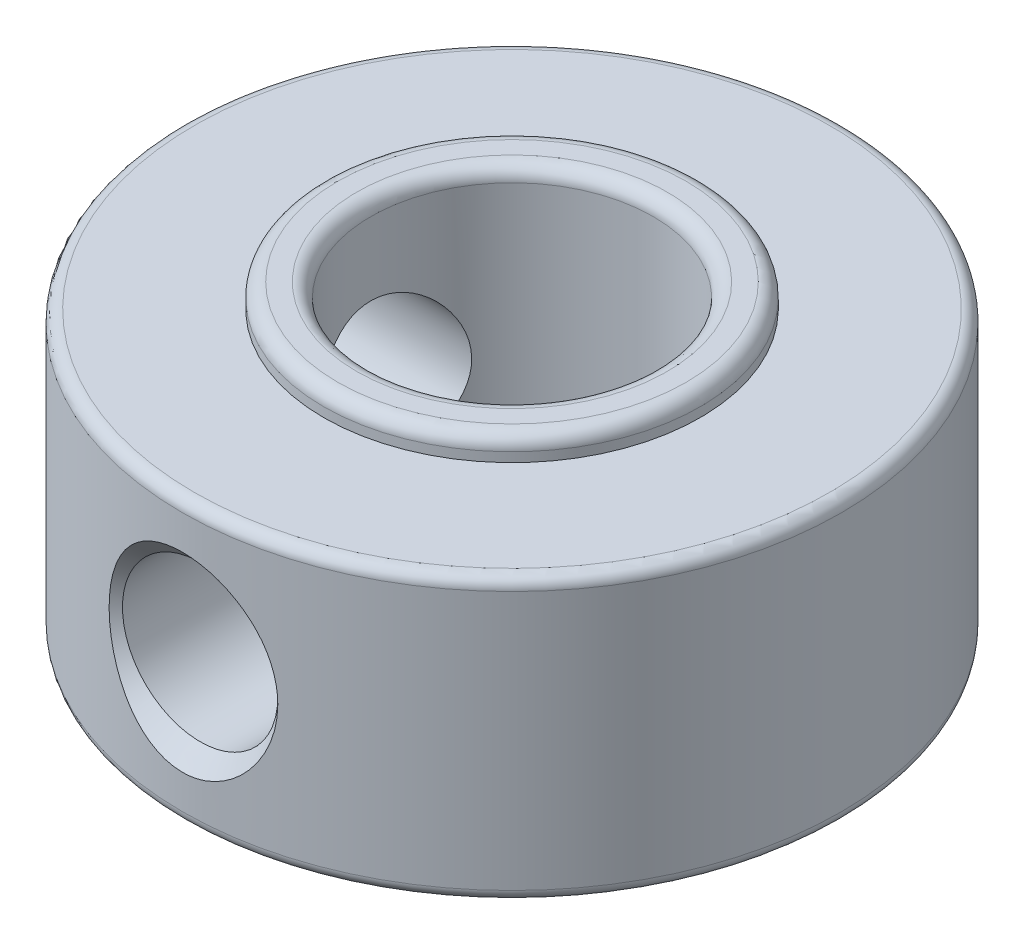
ISO-10303-21;
HEADER;
FILE_DESCRIPTION(('STEP AP214'),'2;1');
FILE_NAME('part.step','',(''),(''),'','','');
FILE_SCHEMA(('AUTOMOTIVE_DESIGN { 1 0 10303 214 1 1 1 1 }'));
ENDSEC;
DATA;
#1=APPLICATION_CONTEXT('core data for automotive mechanical design processes');
#2=APPLICATION_PROTOCOL_DEFINITION('international standard','automotive_design',2000,#1);
#3=PRODUCT_CONTEXT('',#1,'mechanical');
#4=PRODUCT('Part','Part','',(#3));
#5=PRODUCT_RELATED_PRODUCT_CATEGORY('part','',(#4));
#6=PRODUCT_DEFINITION_FORMATION('','',#4);
#7=PRODUCT_DEFINITION_CONTEXT('part definition',#1,'design');
#8=PRODUCT_DEFINITION('design','',#6,#7);
#9=PRODUCT_DEFINITION_SHAPE('','',#8);
#10=(LENGTH_UNIT() NAMED_UNIT(*) SI_UNIT(.MILLI.,.METRE.));
#11=(NAMED_UNIT(*) PLANE_ANGLE_UNIT() SI_UNIT($,.RADIAN.));
#12=(NAMED_UNIT(*) SI_UNIT($,.STERADIAN.) SOLID_ANGLE_UNIT());
#13=UNCERTAINTY_MEASURE_WITH_UNIT(LENGTH_MEASURE(1.E-05),#10,'distance_accuracy_value','');
#14=(GEOMETRIC_REPRESENTATION_CONTEXT(3) GLOBAL_UNCERTAINTY_ASSIGNED_CONTEXT((#13)) GLOBAL_UNIT_ASSIGNED_CONTEXT((#10,
#11,#12)) REPRESENTATION_CONTEXT('',''));
#15=CARTESIAN_POINT('',(0.,0.,0.));
#16=DIRECTION('',(0.,0.,1.));
#17=DIRECTION('',(1.,0.,0.));
#18=AXIS2_PLACEMENT_3D('',#15,#16,#17);
#19=CARTESIAN_POINT('',(0.,6.,0.));
#20=DIRECTION('',(0.,1.,0.));
#21=DIRECTION('',(0.,0.,1.));
#22=AXIS2_PLACEMENT_3D('',#19,#20,#21);
#23=PLANE('',#22);
#24=CARTESIAN_POINT('',(0.,6.,0.));
#25=DIRECTION('',(0.,1.,0.));
#26=DIRECTION('',(0.,0.,1.));
#27=AXIS2_PLACEMENT_3D('',#24,#25,#26);
#28=CIRCLE('',#27,6.75);
#29=CARTESIAN_POINT('',(0.,6.,6.75));
#30=VERTEX_POINT('',#29);
#31=EDGE_CURVE('E50',#30,#30,#28,.T.);
#32=ORIENTED_EDGE('',*,*,#31,.T.);
#33=EDGE_LOOP('',(#32));
#34=FACE_BOUND('',#33,.T.);
#35=CARTESIAN_POINT('',(0.,6.,0.));
#36=DIRECTION('',(0.,1.,0.));
#37=DIRECTION('',(0.,0.,1.));
#38=AXIS2_PLACEMENT_3D('',#35,#36,#37);
#39=CIRCLE('',#38,4.);
#40=CARTESIAN_POINT('',(0.,6.,4.));
#41=VERTEX_POINT('',#40);
#42=EDGE_CURVE('E89',#41,#41,#39,.T.);
#43=ORIENTED_EDGE('',*,*,#42,.F.);
#44=EDGE_LOOP('',(#43));
#45=FACE_BOUND('',#44,.T.);
#46=ADVANCED_FACE('F34',(#34,#45),#23,.T.);
#47=CARTESIAN_POINT('',(0.,0.,0.));
#48=DIRECTION('',(0.,1.,0.));
#49=DIRECTION('',(0.,0.,1.));
#50=AXIS2_PLACEMENT_3D('',#47,#48,#49);
#51=PLANE('',#50);
#52=CARTESIAN_POINT('',(0.,0.,0.));
#53=DIRECTION('',(0.,1.,0.));
#54=DIRECTION('',(0.,0.,1.));
#55=AXIS2_PLACEMENT_3D('',#52,#53,#54);
#56=CIRCLE('',#55,6.75);
#57=CARTESIAN_POINT('',(0.,0.,6.75));
#58=VERTEX_POINT('',#57);
#59=EDGE_CURVE('E54',#58,#58,#56,.F.);
#60=ORIENTED_EDGE('',*,*,#59,.T.);
#61=EDGE_LOOP('',(#60));
#62=FACE_BOUND('',#61,.T.);
#63=CARTESIAN_POINT('',(0.,0.,0.));
#64=DIRECTION('',(0.,1.,0.));
#65=DIRECTION('',(0.,0.,1.));
#66=AXIS2_PLACEMENT_3D('',#63,#64,#65);
#67=CIRCLE('',#66,3.);
#68=CARTESIAN_POINT('',(0.,0.,3.));
#69=VERTEX_POINT('',#68);
#70=EDGE_CURVE('E94',#69,#69,#67,.T.);
#71=ORIENTED_EDGE('',*,*,#70,.T.);
#72=EDGE_LOOP('',(#71));
#73=FACE_BOUND('',#72,.T.);
#74=ADVANCED_FACE('F117',(#62,#73),#51,.F.);
#75=CARTESIAN_POINT('',(0.,6.,0.));
#76=DIRECTION('',(0.,-1.,0.));
#77=DIRECTION('',(0.,0.,-1.));
#78=AXIS2_PLACEMENT_3D('',#75,#76,#77);
#79=CYLINDRICAL_SURFACE('',#78,7.);
#80=CARTESIAN_POINT('',(-6.87359578952103,1.63949092559636,-1.32426621208235));
#81=CARTESIAN_POINT('',(-6.85958303338195,1.72985317819723,-1.39700430517635));
#82=CARTESIAN_POINT('',(-6.84589612643149,1.82673131210786,-1.46185912758933));
#83=CARTESIAN_POINT('',(-6.820808210509,2.03021045980152,-1.57478254868105));
#84=CARTESIAN_POINT('',(-6.80941146577098,2.1368290831704,-1.62281995483144));
#85=CARTESIAN_POINT('',(-6.79017426023101,2.35711382981139,-1.70152481572352));
#86=CARTESIAN_POINT('',(-6.78234906293592,2.47080788405809,-1.73211785571865));
#87=CARTESIAN_POINT('',(-6.77121264697159,2.70173092495826,-1.77515529793583));
#88=CARTESIAN_POINT('',(-6.76789958178469,2.81895844551017,-1.78760712430403));
#89=CARTESIAN_POINT('',(-6.76611964368235,3.0590001213231,-1.79433707930609));
#90=CARTESIAN_POINT('',(-6.76786573540499,3.1818390934097,-1.78781651945037));
#91=CARTESIAN_POINT('',(-6.77645825687172,3.42468982856667,-1.75496312829767));
#92=CARTESIAN_POINT('',(-6.78330610931944,3.54470079337169,-1.72862477048569));
#93=CARTESIAN_POINT('',(-6.80128995036055,3.77875633916343,-1.65645275771337));
#94=CARTESIAN_POINT('',(-6.81243775901388,3.89278348106933,-1.61056532806682));
#95=CARTESIAN_POINT('',(-6.83764161156773,4.1110264336865,-1.49995443148578));
#96=CARTESIAN_POINT('',(-6.8516980295538,4.21524097985733,-1.43522854124074));
#97=CARTESIAN_POINT('',(-6.88045831941093,4.40713047385244,-1.29018663263499));
#98=CARTESIAN_POINT('',(-6.89512946909561,4.49521224860423,-1.21040501078502));
#99=CARTESIAN_POINT('',(-6.92354931193096,4.65479707559183,-1.03550612023776));
#100=CARTESIAN_POINT('',(-6.93729874004048,4.72631345115778,-0.940401280930968));
#101=CARTESIAN_POINT('',(-6.96054348335829,4.84237120528744,-0.747821156421959));
#102=CARTESIAN_POINT('',(-6.97033156888847,4.88893629512083,-0.651606200801385));
#103=CARTESIAN_POINT('',(-6.98612448704767,4.96260309672123,-0.451722639680279));
#104=CARTESIAN_POINT('',(-6.99213432154922,4.98973054786669,-0.348064091999365));
#105=CARTESIAN_POINT('',(-6.99894749138441,5.02034677395272,-0.151767518826994));
#106=CARTESIAN_POINT('',(-7.00035237649864,5.02656970879388,-0.0595704267651771));
#107=CARTESIAN_POINT('',(-6.99949725480007,5.02276007925593,0.124457329254976));
#108=CARTESIAN_POINT('',(-6.99723843902163,5.01273279766869,0.216288102571896));
#109=CARTESIAN_POINT('',(-6.98957490072888,4.97810819206439,0.391230944006008));
#110=CARTESIAN_POINT('',(-6.98436724151803,4.95442198661933,0.474535424107075));
#111=CARTESIAN_POINT('',(-6.97149996791258,4.89437024788566,0.636216769702404));
#112=CARTESIAN_POINT('',(-6.96383997517852,4.8580027580852,0.714592872626157));
#113=CARTESIAN_POINT('',(-6.94630282152861,4.77170906744551,0.869056731950644));
#114=CARTESIAN_POINT('',(-6.93632560977579,4.72113824716319,0.944771276219333));
#115=CARTESIAN_POINT('',(-6.91535459298148,4.60935013168227,1.08770395617125));
#116=CARTESIAN_POINT('',(-6.90436034823307,4.54812822139221,1.15491838688396));
#117=CARTESIAN_POINT('',(-6.88091677928409,4.40877462042631,1.28766145465531));
#118=CARTESIAN_POINT('',(-6.86845401200706,4.32949046948708,1.35197755975986));
#119=CARTESIAN_POINT('',(-6.84458445732909,4.16207180900025,1.46805363591992));
#120=CARTESIAN_POINT('',(-6.83317819661977,4.07393293033306,1.51980736496914));
#121=CARTESIAN_POINT('',(-6.81123069769132,3.88020565834485,1.61549774845669));
#122=CARTESIAN_POINT('',(-6.80094718315777,3.77378254336997,1.65780922978377));
#123=CARTESIAN_POINT('',(-6.78408993326696,3.55540077456816,1.72549781353963));
#124=CARTESIAN_POINT('',(-6.77751726903436,3.44344053259986,1.75087002689004));
#125=CARTESIAN_POINT('',(-6.76852656059429,3.20991891708026,1.78532838014699));
#126=CARTESIAN_POINT('',(-6.76638379936112,3.08818637467319,1.79333684892155));
#127=CARTESIAN_POINT('',(-6.76733137718222,2.84502348440161,1.78975588575182));
#128=CARTESIAN_POINT('',(-6.77042240823588,2.72359317862405,1.77816386227801));
#129=CARTESIAN_POINT('',(-6.78153491091069,2.48290445392508,1.73530349054721));
#130=CARTESIAN_POINT('',(-6.78961752834013,2.36369215522348,1.70379100637556));
#131=CARTESIAN_POINT('',(-6.80977299357164,2.13248812457447,1.62135221348526));
#132=CARTESIAN_POINT('',(-6.82184660845329,2.02049778565465,1.57042217237521));
#133=CARTESIAN_POINT('',(-6.84828599058041,1.80880796178523,1.45074907593046));
#134=CARTESIAN_POINT('',(-6.86261756501572,1.70895927459034,1.3822634554608));
#135=CARTESIAN_POINT('',(-6.89185407270496,1.52346155481056,1.22819818676186));
#136=CARTESIAN_POINT('',(-6.90675882378795,1.43780805582243,1.14262393409211));
#137=CARTESIAN_POINT('',(-6.93398596018628,1.29047399721376,0.963043299679111));
#138=CARTESIAN_POINT('',(-6.94641783889914,1.22748797538864,0.870130440468874));
#139=CARTESIAN_POINT('',(-6.96821846834868,1.12073923215364,0.673532937375931));
#140=CARTESIAN_POINT('',(-6.97759148709104,1.0769496964614,0.569863570647384));
#141=CARTESIAN_POINT('',(-6.99082340905235,1.01609607633617,0.370135060658223));
#142=CARTESIAN_POINT('',(-6.99526151264695,0.996194046897193,0.274976891819246));
#143=CARTESIAN_POINT('',(-7.00017276638536,0.974200619229602,0.0825414787060494));
#144=CARTESIAN_POINT('',(-7.00064877632136,0.97209637475324,-0.0147341863279816));
#145=CARTESIAN_POINT('',(-6.99773389362166,0.98511709275393,-0.198266816928));
#146=CARTESIAN_POINT('',(-6.99472335819632,0.998547186723714,-0.284656397013251));
#147=CARTESIAN_POINT('',(-6.98577870226897,1.0392079040996,-0.453965386225114));
#148=CARTESIAN_POINT('',(-6.97984397155625,1.06644140798641,-0.536884067136763));
#149=CARTESIAN_POINT('',(-6.96554171606365,1.13396797876902,-0.698518729565626));
#150=CARTESIAN_POINT('',(-6.95713682325865,1.17446282372167,-0.77714635497339));
#151=CARTESIAN_POINT('',(-6.93873400044345,1.26672803443802,-0.927193415021082));
#152=CARTESIAN_POINT('',(-6.92873679327125,1.31849328784491,-0.998616096461568));
#153=CARTESIAN_POINT('',(-6.91108573610624,1.41475419430979,-1.11318824076734));
#154=CARTESIAN_POINT('',(-6.9036191041308,1.45683393296166,-1.15842940165299));
#155=CARTESIAN_POINT('',(-6.88860281585189,1.54515759995637,-1.24461335989313));
#156=CARTESIAN_POINT('',(-6.88105315915174,1.5914015482019,-1.28555613670165));
#157=CARTESIAN_POINT('',(-6.87359578952103,1.63949092559636,-1.32426621208235));
#158=B_SPLINE_CURVE_WITH_KNOTS('',3,(#80,#81,#82,#83,#84,#85,#86,#87,#88,#89,#90,#91,#92,#93,
#94,#95,#96,#97,#98,#99,#100,#101,#102,#103,#104,#105,#106,#107,#108,#109,#110,#111,#112,#113,
#114,#115,#116,#117,#118,#119,#120,#121,#122,#123,#124,#125,#126,#127,#128,#129,#130,#131,#132,
#133,#134,#135,#136,#137,#138,#139,#140,#141,#142,#143,#144,#145,#146,#147,#148,#149,#150,#151,
#152,#153,#154,#155,#156,#157),.UNSPECIFIED.,.T.,.F.,(4,2,2,2,2,2,2,2,2,2,2,2,2,2,2,2,2,2,2,2,2,
2,2,2,2,2,2,2,2,2,2,2,2,2,2,2,2,2,4),(0.,0.350301087654824,0.701248505056425,1.05368201579301,
1.40597125538907,1.77330266509892,2.14073654912412,2.50918774656418,2.87768636118012,
3.23497054941263,3.59196637312953,3.91207465179538,4.23175825479954,4.50755014610567,
4.78325239805685,5.04239822079371,5.30158404313585,5.57526733671498,5.84906951329984,
6.15637300433501,6.46382887750418,6.80728976595826,7.15084974264326,7.51518613494137,
7.87957070267978,8.24850994798461,8.61752014559749,8.98140122094162,9.34516758572792,
9.68199902808364,10.0183584622883,10.3086721815315,10.5987763375894,10.8599910565155,
11.121260307904,11.3867055121439,11.6520305580308,11.8384544264437,12.0248791859097),.UNSPECIFIED.);
#159=CARTESIAN_POINT('',(-6.87359578952103,1.63949092559636,-1.32426621208235));
#160=VERTEX_POINT('',#159);
#161=EDGE_CURVE('E10',#160,#160,#158,.T.);
#162=ORIENTED_EDGE('',*,*,#161,.T.);
#163=EDGE_LOOP('',(#162));
#164=FACE_BOUND('',#163,.T.);
#165=CARTESIAN_POINT('',(-1.32426621208233,1.63949092559636,6.87359578952103));
#166=CARTESIAN_POINT('',(-1.39700430517632,1.72985317819723,6.85958303338196));
#167=CARTESIAN_POINT('',(-1.4618591275893,1.82673131210786,6.8458961264315));
#168=CARTESIAN_POINT('',(-1.57478254868103,2.03021045980152,6.820808210509));
#169=CARTESIAN_POINT('',(-1.62281995483142,2.1368290831704,6.80941146577098));
#170=CARTESIAN_POINT('',(-1.70152481572349,2.35711382981139,6.79017426023102));
#171=CARTESIAN_POINT('',(-1.73211785571863,2.47080788405809,6.78234906293593));
#172=CARTESIAN_POINT('',(-1.77515529793581,2.70173092495826,6.7712126469716));
#173=CARTESIAN_POINT('',(-1.78760712430401,2.81895844551017,6.7678995817847));
#174=CARTESIAN_POINT('',(-1.79433707930607,3.0590001213231,6.76611964368236));
#175=CARTESIAN_POINT('',(-1.78781651945035,3.1818390934097,6.767865735405));
#176=CARTESIAN_POINT('',(-1.75496312829765,3.42468982856667,6.77645825687173));
#177=CARTESIAN_POINT('',(-1.72862477048567,3.54470079337169,6.78330610931945));
#178=CARTESIAN_POINT('',(-1.65645275771335,3.77875633916343,6.80128995036056));
#179=CARTESIAN_POINT('',(-1.6105653280668,3.89278348106933,6.81243775901389));
#180=CARTESIAN_POINT('',(-1.49995443148576,4.11102643368651,6.83764161156773));
#181=CARTESIAN_POINT('',(-1.43522854124072,4.21524097985733,6.85169802955381));
#182=CARTESIAN_POINT('',(-1.29018663263497,4.40713047385244,6.88045831941093));
#183=CARTESIAN_POINT('',(-1.210405010785,4.49521224860423,6.89512946909561));
#184=CARTESIAN_POINT('',(-1.03550612023773,4.65479707559183,6.92354931193096));
#185=CARTESIAN_POINT('',(-0.940401280930944,4.72631345115778,6.93729874004048));
#186=CARTESIAN_POINT('',(-0.747821156421934,4.84237120528744,6.9605434833583));
#187=CARTESIAN_POINT('',(-0.65160620080136,4.88893629512083,6.97033156888847));
#188=CARTESIAN_POINT('',(-0.451722639680254,4.96260309672123,6.98612448704767));
#189=CARTESIAN_POINT('',(-0.34806409199934,4.98973054786669,6.99213432154922));
#190=CARTESIAN_POINT('',(-0.151767518826969,5.02034677395272,6.99894749138441));
#191=CARTESIAN_POINT('',(-0.0595704267651527,5.02656970879388,7.00035237649864));
#192=CARTESIAN_POINT('',(0.124457329255,5.02276007925593,6.99949725480007));
#193=CARTESIAN_POINT('',(0.216288102571921,5.01273279766869,6.99723843902163));
#194=CARTESIAN_POINT('',(0.391230944006032,4.97810819206439,6.98957490072888));
#195=CARTESIAN_POINT('',(0.4745354241071,4.95442198661933,6.98436724151803));
#196=CARTESIAN_POINT('',(0.636216769702429,4.89437024788566,6.97149996791257));
#197=CARTESIAN_POINT('',(0.714592872626182,4.8580027580852,6.96383997517852));
#198=CARTESIAN_POINT('',(0.869056731950668,4.77170906744551,6.94630282152861));
#199=CARTESIAN_POINT('',(0.944771276219356,4.72113824716319,6.93632560977579));
#200=CARTESIAN_POINT('',(1.08770395617127,4.60935013168227,6.91535459298147));
#201=CARTESIAN_POINT('',(1.15491838688398,4.54812822139221,6.90436034823307));
#202=CARTESIAN_POINT('',(1.28766145465533,4.40877462042631,6.88091677928409));
#203=CARTESIAN_POINT('',(1.35197755975988,4.32949046948708,6.86845401200705));
#204=CARTESIAN_POINT('',(1.46805363591994,4.16207180900025,6.84458445732908));
#205=CARTESIAN_POINT('',(1.51980736496917,4.07393293033306,6.83317819661976));
#206=CARTESIAN_POINT('',(1.61549774845672,3.88020565834485,6.81123069769132));
#207=CARTESIAN_POINT('',(1.65780922978379,3.77378254336997,6.80094718315777));
#208=CARTESIAN_POINT('',(1.72549781353965,3.55540077456816,6.78408993326695));
#209=CARTESIAN_POINT('',(1.75087002689007,3.44344053259986,6.77751726903435));
#210=CARTESIAN_POINT('',(1.78532838014701,3.20991891708026,6.76852656059429));
#211=CARTESIAN_POINT('',(1.79333684892158,3.08818637467319,6.76638379936111));
#212=CARTESIAN_POINT('',(1.78975588575184,2.84502348440161,6.76733137718221));
#213=CARTESIAN_POINT('',(1.77816386227803,2.72359317862405,6.77042240823587));
#214=CARTESIAN_POINT('',(1.73530349054723,2.48290445392508,6.78153491091068));
#215=CARTESIAN_POINT('',(1.70379100637558,2.36369215522347,6.78961752834012));
#216=CARTESIAN_POINT('',(1.62135221348528,2.13248812457446,6.80977299357163));
#217=CARTESIAN_POINT('',(1.57042217237524,2.02049778565465,6.82184660845329));
#218=CARTESIAN_POINT('',(1.45074907593048,1.80880796178523,6.84828599058041));
#219=CARTESIAN_POINT('',(1.38226345546082,1.70895927459034,6.86261756501571));
#220=CARTESIAN_POINT('',(1.22819818676188,1.52346155481056,6.89185407270496));
#221=CARTESIAN_POINT('',(1.14262393409214,1.43780805582243,6.90675882378795));
#222=CARTESIAN_POINT('',(0.963043299679133,1.29047399721376,6.93398596018628));
#223=CARTESIAN_POINT('',(0.870130440468897,1.22748797538864,6.94641783889914));
#224=CARTESIAN_POINT('',(0.673532937375954,1.12073923215364,6.96821846834868));
#225=CARTESIAN_POINT('',(0.569863570647407,1.0769496964614,6.97759148709104));
#226=CARTESIAN_POINT('',(0.370135060658246,1.01609607633617,6.99082340905235));
#227=CARTESIAN_POINT('',(0.27497689181927,0.996194046897193,6.99526151264695));
#228=CARTESIAN_POINT('',(0.0825414787060733,0.974200619229602,7.00017276638536));
#229=CARTESIAN_POINT('',(-0.0147341863279577,0.972096374753239,7.00064877632136));
#230=CARTESIAN_POINT('',(-0.198266816927976,0.985117092753929,6.99773389362167));
#231=CARTESIAN_POINT('',(-0.284656397013227,0.998547186723713,6.99472335819632));
#232=CARTESIAN_POINT('',(-0.45396538622509,1.0392079040996,6.98577870226897));
#233=CARTESIAN_POINT('',(-0.53688406713674,1.06644140798641,6.97984397155625));
#234=CARTESIAN_POINT('',(-0.698518729565602,1.13396797876902,6.96554171606365));
#235=CARTESIAN_POINT('',(-0.777146354973366,1.17446282372167,6.95713682325865));
#236=CARTESIAN_POINT('',(-0.927193415021058,1.26672803443802,6.93873400044345));
#237=CARTESIAN_POINT('',(-0.998616096461544,1.31849328784491,6.92873679327126));
#238=CARTESIAN_POINT('',(-1.11318824076732,1.41475419430979,6.91108573610625));
#239=CARTESIAN_POINT('',(-1.15842940165296,1.45683393296166,6.90361910413081));
#240=CARTESIAN_POINT('',(-1.24461335989311,1.54515759995637,6.88860281585189));
#241=CARTESIAN_POINT('',(-1.28555613670162,1.5914015482019,6.88105315915175));
#242=CARTESIAN_POINT('',(-1.32426621208233,1.63949092559636,6.87359578952103));
#243=B_SPLINE_CURVE_WITH_KNOTS('',3,(#165,#166,#167,#168,#169,#170,#171,#172,#173,#174,#175,
#176,#177,#178,#179,#180,#181,#182,#183,#184,#185,#186,#187,#188,#189,#190,#191,#192,#193,#194,
#195,#196,#197,#198,#199,#200,#201,#202,#203,#204,#205,#206,#207,#208,#209,#210,#211,#212,#213,
#214,#215,#216,#217,#218,#219,#220,#221,#222,#223,#224,#225,#226,#227,#228,#229,#230,#231,#232,
#233,#234,#235,#236,#237,#238,#239,#240,#241,#242),.UNSPECIFIED.,.T.,.F.,(4,2,2,2,2,2,2,2,2,2,2,
2,2,2,2,2,2,2,2,2,2,2,2,2,2,2,2,2,2,2,2,2,2,2,2,2,2,2,4),(0.,0.350301087654825,
0.701248505056426,1.05368201579301,1.40597125538907,1.77330266509892,2.14073654912413,
2.50918774656418,2.87768636118012,3.23497054941263,3.59196637312953,3.91207465179538,
4.23175825479954,4.50755014610567,4.78325239805685,5.04239822079371,5.30158404313585,
5.57526733671498,5.84906951329984,6.15637300433501,6.46382887750418,6.80728976595826,
7.15084974264326,7.51518613494138,7.87957070267978,8.24850994798461,8.61752014559749,
8.98140122094161,9.34516758572792,9.68199902808364,10.0183584622883,10.3086721815315,
10.5987763375894,10.8599910565155,11.121260307904,11.3867055121439,11.6520305580308,
11.8384544264437,12.0248791859097),.UNSPECIFIED.);
#244=CARTESIAN_POINT('',(-1.32426621208233,1.63949092559636,6.87359578952103));
#245=VERTEX_POINT('',#244);
#246=EDGE_CURVE('E46',#245,#245,#243,.T.);
#247=ORIENTED_EDGE('',*,*,#246,.T.);
#248=EDGE_LOOP('',(#247));
#249=FACE_BOUND('',#248,.T.);
#250=CARTESIAN_POINT('',(0.,0.25,0.));
#251=DIRECTION('',(0.,1.,0.));
#252=DIRECTION('',(0.,0.,1.));
#253=AXIS2_PLACEMENT_3D('',#250,#251,#252);
#254=CIRCLE('',#253,7.);
#255=CARTESIAN_POINT('',(0.,0.25,7.));
#256=VERTEX_POINT('',#255);
#257=EDGE_CURVE('E112',#256,#256,#254,.T.);
#258=ORIENTED_EDGE('',*,*,#257,.T.);
#259=EDGE_LOOP('',(#258));
#260=FACE_BOUND('',#259,.T.);
#261=CARTESIAN_POINT('',(0.,5.75,0.));
#262=DIRECTION('',(0.,1.,0.));
#263=DIRECTION('',(0.,0.,1.));
#264=AXIS2_PLACEMENT_3D('',#261,#262,#263);
#265=CIRCLE('',#264,7.);
#266=CARTESIAN_POINT('',(0.,5.75,7.));
#267=VERTEX_POINT('',#266);
#268=EDGE_CURVE('E109',#267,#267,#265,.F.);
#269=ORIENTED_EDGE('',*,*,#268,.T.);
#270=EDGE_LOOP('',(#269));
#271=FACE_BOUND('',#270,.T.);
#272=ADVANCED_FACE('F61',(#164,#249,#260,#271),#79,.T.);
#273=CARTESIAN_POINT('',(0.,6.,0.));
#274=DIRECTION('',(0.,-1.,0.));
#275=DIRECTION('',(0.,0.,-1.));
#276=AXIS2_PLACEMENT_3D('',#273,#274,#275);
#277=CYLINDRICAL_SURFACE('',#276,3.);
#278=CARTESIAN_POINT('',(-2.50549396327352,3.,1.64999999999998));
#279=CARTESIAN_POINT('',(-2.50550290729146,2.91543775587578,1.64999358115513));
#280=CARTESIAN_POINT('',(-2.50984278304634,2.83080158035625,1.64345412095507));
#281=CARTESIAN_POINT('',(-2.52652305472094,2.6642419893439,1.61768357796127));
#282=CARTESIAN_POINT('',(-2.53887693813341,2.58232339226291,1.59843109830518));
#283=CARTESIAN_POINT('',(-2.56969514424061,2.42394184165836,1.5483913350412));
#284=CARTESIAN_POINT('',(-2.58812128253768,2.34744833636022,1.51767597794514));
#285=CARTESIAN_POINT('',(-2.62894573960705,2.20072925067674,1.44580368027314));
#286=CARTESIAN_POINT('',(-2.6513448858674,2.13050498062123,1.404644563727));
#287=CARTESIAN_POINT('',(-2.70034227169486,1.99050697951391,1.30818987552101));
#288=CARTESIAN_POINT('',(-2.72713610292844,1.92149614307966,1.25188597568527));
#289=CARTESIAN_POINT('',(-2.7803340212233,1.79328457524385,1.12882249865067));
#290=CARTESIAN_POINT('',(-2.80673786625031,1.73408972055438,1.06205670422281));
#291=CARTESIAN_POINT('',(-2.85888255333957,1.62218721247504,0.912984038802328));
#292=CARTESIAN_POINT('',(-2.88437182872329,1.57047291087438,0.829835009326239));
#293=CARTESIAN_POINT('',(-2.9291637746478,1.48212209381967,0.65434955639788));
#294=CARTESIAN_POINT('',(-2.94847115688417,1.44547408910425,0.562020200659671));
#295=CARTESIAN_POINT('',(-2.97729382330391,1.39150601520038,0.378922854343159));
#296=CARTESIAN_POINT('',(-2.98749000620555,1.37283185672805,0.288663762188296));
#297=CARTESIAN_POINT('',(-2.99953120217528,1.35082522164807,0.105768848971913));
#298=CARTESIAN_POINT('',(-3.00138254652496,1.34748111400143,0.0131348834272767));
#299=CARTESIAN_POINT('',(-2.99679126383707,1.35584012373691,-0.161456942743388));
#300=CARTESIAN_POINT('',(-2.99119680588262,1.36600430103804,-0.243517036042426));
#301=CARTESIAN_POINT('',(-2.97370139090637,1.39825613933328,-0.404548934713688));
#302=CARTESIAN_POINT('',(-2.96179994958743,1.42034471597396,-0.483520502425816));
#303=CARTESIAN_POINT('',(-2.93258792133284,1.47581759545011,-0.637279429786414));
#304=CARTESIAN_POINT('',(-2.91522047737549,1.50932095125489,-0.712012587065499));
#305=CARTESIAN_POINT('',(-2.87655421939416,1.58643144614226,-0.854941741305344));
#306=CARTESIAN_POINT('',(-2.85525414826244,1.63004181718505,-0.923135637298126));
#307=CARTESIAN_POINT('',(-2.80791814382438,1.73148475004153,-1.05891717191854));
#308=CARTESIAN_POINT('',(-2.78161920172534,1.79034393087261,-1.12564617195586));
#309=CARTESIAN_POINT('',(-2.72855637999779,1.91792420544976,-1.24879377983836));
#310=CARTESIAN_POINT('',(-2.70179204741386,1.98665544125848,-1.3052016470546));
#311=CARTESIAN_POINT('',(-2.64816260741378,2.13929795422944,-1.41104757147093));
#312=CARTESIAN_POINT('',(-2.62149493557528,2.22401217497651,-1.45943898084593));
#313=CARTESIAN_POINT('',(-2.57442669454811,2.4020876587557,-1.54096072440202));
#314=CARTESIAN_POINT('',(-2.55401888906632,2.49543877389512,-1.57410870202277));
#315=CARTESIAN_POINT('',(-2.52428868885372,2.68038243391405,-1.621324807476));
#316=CARTESIAN_POINT('',(-2.51420388175754,2.77150770718116,-1.63671808149072));
#317=CARTESIAN_POINT('',(-2.50421132283931,2.95556143260455,-1.65197600548299));
#318=CARTESIAN_POINT('',(-2.50429193328554,3.0484877010052,-1.65185841284551));
#319=CARTESIAN_POINT('',(-2.51381291635781,3.21898069677553,-1.63731066997579));
#320=CARTESIAN_POINT('',(-2.52189118280772,3.29681676278818,-1.6249632757909));
#321=CARTESIAN_POINT('',(-2.54430898316227,3.4490948427084,-1.58963092545288));
#322=CARTESIAN_POINT('',(-2.55865126498177,3.52353535119722,-1.56664130047228));
#323=CARTESIAN_POINT('',(-2.59264701052962,3.67056841434069,-1.50974087534156));
#324=CARTESIAN_POINT('',(-2.61249886195853,3.74295082069504,-1.47541058671725));
#325=CARTESIAN_POINT('',(-2.6551752562818,3.88136153298298,-1.39715088074391));
#326=CARTESIAN_POINT('',(-2.67800126759515,3.94738667198258,-1.35321671440464));
#327=CARTESIAN_POINT('',(-2.72838745980259,4.08217598283305,-1.24890384728535));
#328=CARTESIAN_POINT('',(-2.75612471210542,4.14971665545364,-1.18702256034847));
#329=CARTESIAN_POINT('',(-2.81021466477288,4.27394463458244,-1.05259034248068));
#330=CARTESIAN_POINT('',(-2.83656654669951,4.33062557660594,-0.980033198593376));
#331=CARTESIAN_POINT('',(-2.88655886174343,4.43418356477833,-0.821591432017623));
#332=CARTESIAN_POINT('',(-2.90999476284885,4.48041980778174,-0.735218364495388));
#333=CARTESIAN_POINT('',(-2.94980224898628,4.55721430537586,-0.554269536180267));
#334=CARTESIAN_POINT('',(-2.96618117604292,4.58778886056153,-0.459702424085396));
#335=CARTESIAN_POINT('',(-2.98862325067975,4.62930611839182,-0.275417797995461));
#336=CARTESIAN_POINT('',(-2.99556705432428,4.64193096934434,-0.186187129425343));
#337=CARTESIAN_POINT('',(-3.00133436858647,4.65243189343454,-0.00661676308887106));
#338=CARTESIAN_POINT('',(-3.00016215675142,4.65031573581961,0.0837223254250865));
#339=CARTESIAN_POINT('',(-2.99031042427524,4.63233007153812,0.254358366297024));
#340=CARTESIAN_POINT('',(-2.98231104671829,4.61770633320566,0.334831363047826));
#341=CARTESIAN_POINT('',(-2.9604470102538,4.57703517800952,0.49198583387687));
#342=CARTESIAN_POINT('',(-2.94658165149358,4.55098639804465,0.568666854326139));
#343=CARTESIAN_POINT('',(-2.91359875185443,4.48738736796037,0.719080279481083));
#344=CARTESIAN_POINT('',(-2.89431787940932,4.44947440595497,0.792622296205392));
#345=CARTESIAN_POINT('',(-2.85231650614788,4.36367449851232,0.932542405269443));
#346=CARTESIAN_POINT('',(-2.82959461529655,4.31578351940047,0.998917583844708));
#347=CARTESIAN_POINT('',(-2.77974517125016,4.20507399834961,1.13072210629173));
#348=CARTESIAN_POINT('',(-2.75241145940814,4.14117216627432,1.19516495605845));
#349=CARTESIAN_POINT('',(-2.69823878537055,4.00349286244808,1.31290440702819));
#350=CARTESIAN_POINT('',(-2.67140046184163,3.92970353472664,1.3661874269137));
#351=CARTESIAN_POINT('',(-2.61945108088932,3.76827599994855,1.46345962344262));
#352=CARTESIAN_POINT('',(-2.59457299089605,3.68004360140734,1.50659692748027));
#353=CARTESIAN_POINT('',(-2.55252885584285,3.49582119959131,1.57680093269353));
#354=CARTESIAN_POINT('',(-2.53533827536758,3.39985704717182,1.60391885150152));
#355=CARTESIAN_POINT('',(-2.51766925413211,3.25219121694153,1.63139486596089));
#356=CARTESIAN_POINT('',(-2.51313062613143,3.20212523584002,1.63835444049928));
#357=CARTESIAN_POINT('',(-2.50704033236466,3.10138168759252,1.64765888075613));
#358=CARTESIAN_POINT('',(-2.50548860037559,3.05070413403086,1.65000384878584));
#359=CARTESIAN_POINT('',(-2.50549396327352,3.,1.64999999999998));
#360=B_SPLINE_CURVE_WITH_KNOTS('',3,(#278,#279,#280,#281,#282,#283,#284,#285,#286,#287,#288,
#289,#290,#291,#292,#293,#294,#295,#296,#297,#298,#299,#300,#301,#302,#303,#304,#305,#306,#307,
#308,#309,#310,#311,#312,#313,#314,#315,#316,#317,#318,#319,#320,#321,#322,#323,#324,#325,#326,
#327,#328,#329,#330,#331,#332,#333,#334,#335,#336,#337,#338,#339,#340,#341,#342,#343,#344,#345,
#346,#347,#348,#349,#350,#351,#352,#353,#354,#355,#356,#357,#358,#359),.UNSPECIFIED.,.T.,.F.,(4,
2,2,2,2,2,2,2,2,2,2,2,2,2,2,2,2,2,2,2,2,2,2,2,2,2,2,2,2,2,2,2,2,2,2,2,2,2,2,2,4),(0.,
0.253471464978915,0.507370630471961,0.759702723718413,1.0120874338999,1.28998079678324,
1.56803993512379,1.86997289364919,2.17167517502775,2.44828286528194,2.72468065617496,
2.97213663093978,3.21961160997026,3.46975098230536,3.71997045333203,3.99717687977862,
4.27467015892954,4.57652503396564,4.87802964361058,5.1551747562746,5.43200258623576,
5.66859462056205,5.90529054812097,6.15196333618105,6.3987583777052,6.68465599353128,
6.97072065421032,7.27125286686229,7.5714716485053,7.8411174720333,8.11062118950827,
8.35604451303951,8.60149712555495,8.85533990697402,9.10928550569671,9.39243346006444,
9.67592402360683,9.9782355672993,10.279575245972,10.4315619419379,10.5835452681421),.UNSPECIFIED.);
#361=CARTESIAN_POINT('',(-2.50549396327352,3.,1.64999999999998));
#362=VERTEX_POINT('',#361);
#363=EDGE_CURVE('E257',#362,#362,#360,.T.);
#364=ORIENTED_EDGE('',*,*,#363,.F.);
#365=EDGE_LOOP('',(#364));
#366=FACE_BOUND('',#365,.T.);
#367=CARTESIAN_POINT('',(1.64999999999999,3.,2.50549396327352));
#368=CARTESIAN_POINT('',(1.64999358115514,2.91543775587578,2.50550290729146));
#369=CARTESIAN_POINT('',(1.64345412095508,2.83080158035625,2.50984278304634));
#370=CARTESIAN_POINT('',(1.61768357796128,2.6642419893439,2.52652305472094));
#371=CARTESIAN_POINT('',(1.59843109830519,2.58232339226291,2.5388769381334));
#372=CARTESIAN_POINT('',(1.54839133504121,2.42394184165836,2.56969514424061));
#373=CARTESIAN_POINT('',(1.51767597794515,2.34744833636022,2.58812128253768));
#374=CARTESIAN_POINT('',(1.44580368027315,2.20072925067674,2.62894573960704));
#375=CARTESIAN_POINT('',(1.40464456372701,2.13050498062123,2.6513448858674));
#376=CARTESIAN_POINT('',(1.30818987552102,1.99050697951391,2.70034227169486));
#377=CARTESIAN_POINT('',(1.25188597568528,1.92149614307966,2.72713610292843));
#378=CARTESIAN_POINT('',(1.12882249865068,1.79328457524385,2.7803340212233));
#379=CARTESIAN_POINT('',(1.06205670422282,1.73408972055438,2.8067378662503));
#380=CARTESIAN_POINT('',(0.912984038802338,1.62218721247504,2.85888255333956));
#381=CARTESIAN_POINT('',(0.829835009326248,1.57047291087438,2.88437182872328));
#382=CARTESIAN_POINT('',(0.654349556397889,1.48212209381967,2.92916377464779));
#383=CARTESIAN_POINT('',(0.562020200659681,1.44547408910425,2.94847115688416));
#384=CARTESIAN_POINT('',(0.378922854343169,1.39150601520038,2.9772938233039));
#385=CARTESIAN_POINT('',(0.288663762188306,1.37283185672805,2.98749000620555));
#386=CARTESIAN_POINT('',(0.105768848971924,1.35082522164807,2.99953120217528));
#387=CARTESIAN_POINT('',(0.013134883427287,1.34748111400143,3.00138254652496));
#388=CARTESIAN_POINT('',(-0.161456942743378,1.35584012373691,2.99679126383707));
#389=CARTESIAN_POINT('',(-0.243517036042415,1.36600430103804,2.99119680588262));
#390=CARTESIAN_POINT('',(-0.404548934713678,1.39825613933328,2.97370139090637));
#391=CARTESIAN_POINT('',(-0.483520502425805,1.42034471597396,2.96179994958743));
#392=CARTESIAN_POINT('',(-0.637279429786404,1.47581759545011,2.93258792133285));
#393=CARTESIAN_POINT('',(-0.712012587065489,1.50932095125489,2.91522047737549));
#394=CARTESIAN_POINT('',(-0.854941741305334,1.58643144614226,2.87655421939416));
#395=CARTESIAN_POINT('',(-0.923135637298116,1.63004181718505,2.85525414826244));
#396=CARTESIAN_POINT('',(-1.05891717191853,1.73148475004153,2.80791814382438));
#397=CARTESIAN_POINT('',(-1.12564617195585,1.79034393087261,2.78161920172535));
#398=CARTESIAN_POINT('',(-1.24879377983835,1.91792420544976,2.7285563799978));
#399=CARTESIAN_POINT('',(-1.30520164705459,1.98665544125848,2.70179204741387));
#400=CARTESIAN_POINT('',(-1.41104757147092,2.13929795422944,2.64816260741379));
#401=CARTESIAN_POINT('',(-1.45943898084593,2.22401217497652,2.62149493557529));
#402=CARTESIAN_POINT('',(-1.54096072440201,2.4020876587557,2.57442669454812));
#403=CARTESIAN_POINT('',(-1.57410870202276,2.49543877389512,2.55401888906633));
#404=CARTESIAN_POINT('',(-1.62132480747599,2.68038243391405,2.52428868885372));
#405=CARTESIAN_POINT('',(-1.63671808149071,2.77150770718116,2.51420388175755));
#406=CARTESIAN_POINT('',(-1.65197600548299,2.95556143260455,2.50421132283932));
#407=CARTESIAN_POINT('',(-1.6518584128455,3.0484877010052,2.50429193328555));
#408=CARTESIAN_POINT('',(-1.63731066997578,3.21898069677553,2.51381291635782));
#409=CARTESIAN_POINT('',(-1.62496327579089,3.29681676278818,2.52189118280773));
#410=CARTESIAN_POINT('',(-1.58963092545287,3.4490948427084,2.54430898316228));
#411=CARTESIAN_POINT('',(-1.56664130047227,3.52353535119722,2.55865126498177));
#412=CARTESIAN_POINT('',(-1.50974087534155,3.67056841434069,2.59264701052963));
#413=CARTESIAN_POINT('',(-1.47541058671724,3.74295082069504,2.61249886195854));
#414=CARTESIAN_POINT('',(-1.3971508807439,3.88136153298298,2.65517525628181));
#415=CARTESIAN_POINT('',(-1.35321671440463,3.94738667198258,2.67800126759515));
#416=CARTESIAN_POINT('',(-1.24890384728534,4.08217598283305,2.72838745980259));
#417=CARTESIAN_POINT('',(-1.18702256034846,4.14971665545364,2.75612471210543));
#418=CARTESIAN_POINT('',(-1.05259034248067,4.27394463458244,2.81021466477288));
#419=CARTESIAN_POINT('',(-0.980033198593365,4.33062557660594,2.83656654669952));
#420=CARTESIAN_POINT('',(-0.821591432017612,4.43418356477833,2.88655886174344));
#421=CARTESIAN_POINT('',(-0.735218364495378,4.48041980778174,2.90999476284886));
#422=CARTESIAN_POINT('',(-0.554269536180256,4.55721430537586,2.94980224898629));
#423=CARTESIAN_POINT('',(-0.459702424085386,4.58778886056153,2.96618117604292));
#424=CARTESIAN_POINT('',(-0.275417797995451,4.62930611839182,2.98862325067975));
#425=CARTESIAN_POINT('',(-0.186187129425332,4.64193096934434,2.99556705432428));
#426=CARTESIAN_POINT('',(-0.00661676308886061,4.65243189343454,3.00133436858647));
#427=CARTESIAN_POINT('',(0.0837223254250972,4.65031573581961,3.00016215675142));
#428=CARTESIAN_POINT('',(0.254358366297035,4.63233007153812,2.99031042427524));
#429=CARTESIAN_POINT('',(0.334831363047836,4.61770633320566,2.98231104671828));
#430=CARTESIAN_POINT('',(0.49198583387688,4.57703517800952,2.96044701025379));
#431=CARTESIAN_POINT('',(0.568666854326149,4.55098639804465,2.94658165149358));
#432=CARTESIAN_POINT('',(0.719080279481094,4.48738736796037,2.91359875185443));
#433=CARTESIAN_POINT('',(0.792622296205404,4.44947440595496,2.89431787940932));
#434=CARTESIAN_POINT('',(0.932542405269455,4.36367449851232,2.85231650614788));
#435=CARTESIAN_POINT('',(0.998917583844719,4.31578351940047,2.82959461529654));
#436=CARTESIAN_POINT('',(1.13072210629174,4.20507399834961,2.77974517125015));
#437=CARTESIAN_POINT('',(1.19516495605846,4.14117216627432,2.75241145940814));
#438=CARTESIAN_POINT('',(1.31290440702821,4.00349286244808,2.69823878537055));
#439=CARTESIAN_POINT('',(1.36618742691371,3.92970353472664,2.67140046184162));
#440=CARTESIAN_POINT('',(1.46345962344262,3.76827599994855,2.61945108088931));
#441=CARTESIAN_POINT('',(1.50659692748028,3.68004360140734,2.59457299089604));
#442=CARTESIAN_POINT('',(1.57680093269354,3.49582119959131,2.55252885584285));
#443=CARTESIAN_POINT('',(1.60391885150153,3.39985704717182,2.53533827536758));
#444=CARTESIAN_POINT('',(1.6313948659609,3.25219121694153,2.5176692541321));
#445=CARTESIAN_POINT('',(1.63835444049929,3.20212523584002,2.51313062613142));
#446=CARTESIAN_POINT('',(1.64765888075614,3.10138168759252,2.50704033236465));
#447=CARTESIAN_POINT('',(1.65000384878585,3.05070413403086,2.50548860037558));
#448=CARTESIAN_POINT('',(1.64999999999999,3.,2.50549396327352));
#449=B_SPLINE_CURVE_WITH_KNOTS('',3,(#367,#368,#369,#370,#371,#372,#373,#374,#375,#376,#377,
#378,#379,#380,#381,#382,#383,#384,#385,#386,#387,#388,#389,#390,#391,#392,#393,#394,#395,#396,
#397,#398,#399,#400,#401,#402,#403,#404,#405,#406,#407,#408,#409,#410,#411,#412,#413,#414,#415,
#416,#417,#418,#419,#420,#421,#422,#423,#424,#425,#426,#427,#428,#429,#430,#431,#432,#433,#434,
#435,#436,#437,#438,#439,#440,#441,#442,#443,#444,#445,#446,#447,#448),.UNSPECIFIED.,.T.,.F.,(4,
2,2,2,2,2,2,2,2,2,2,2,2,2,2,2,2,2,2,2,2,2,2,2,2,2,2,2,2,2,2,2,2,2,2,2,2,2,2,2,4),(0.,
0.253471464978916,0.507370630471962,0.759702723718414,1.0120874338999,1.28998079678324,
1.56803993512379,1.86997289364919,2.17167517502775,2.44828286528194,2.72468065617496,
2.97213663093978,3.21961160997026,3.46975098230536,3.71997045333203,3.99717687977862,
4.27467015892954,4.57652503396564,4.87802964361058,5.1551747562746,5.43200258623576,
5.66859462056205,5.90529054812097,6.15196333618106,6.3987583777052,6.68465599353128,
6.97072065421032,7.27125286686229,7.5714716485053,7.8411174720333,8.11062118950827,
8.35604451303951,8.60149712555495,8.85533990697402,9.10928550569671,9.39243346006444,
9.67592402360684,9.9782355672993,10.279575245972,10.4315619419379,10.5835452681421),.UNSPECIFIED.);
#450=CARTESIAN_POINT('',(1.64999999999999,3.,2.50549396327352));
#451=VERTEX_POINT('',#450);
#452=EDGE_CURVE('E82',#451,#451,#449,.T.);
#453=ORIENTED_EDGE('',*,*,#452,.F.);
#454=EDGE_LOOP('',(#453));
#455=FACE_BOUND('',#454,.T.);
#456=CARTESIAN_POINT('',(0.,6.2,0.));
#457=DIRECTION('',(0.,1.,0.));
#458=DIRECTION('',(0.,0.,1.));
#459=AXIS2_PLACEMENT_3D('',#456,#457,#458);
#460=CIRCLE('',#459,3.);
#461=CARTESIAN_POINT('',(0.,6.2,3.));
#462=VERTEX_POINT('',#461);
#463=EDGE_CURVE('E97',#462,#462,#460,.T.);
#464=ORIENTED_EDGE('',*,*,#463,.T.);
#465=EDGE_LOOP('',(#464));
#466=FACE_BOUND('',#465,.T.);
#467=ORIENTED_EDGE('',*,*,#70,.F.);
#468=EDGE_LOOP('',(#467));
#469=FACE_BOUND('',#468,.T.);
#470=ADVANCED_FACE('F128',(#366,#455,#466,#469),#277,.F.);
#471=CARTESIAN_POINT('',(0.,6.5,0.));
#472=DIRECTION('',(0.,1.,0.));
#473=DIRECTION('',(0.,0.,1.));
#474=AXIS2_PLACEMENT_3D('',#471,#472,#473);
#475=PLANE('',#474);
#476=CARTESIAN_POINT('',(0.,6.5,0.));
#477=DIRECTION('',(0.,1.,0.));
#478=DIRECTION('',(0.,0.,1.));
#479=AXIS2_PLACEMENT_3D('',#476,#477,#478);
#480=CIRCLE('',#479,3.3);
#481=CARTESIAN_POINT('',(0.,6.5,3.3));
#482=VERTEX_POINT('',#481);
#483=EDGE_CURVE('E103',#482,#482,#480,.F.);
#484=ORIENTED_EDGE('',*,*,#483,.T.);
#485=EDGE_LOOP('',(#484));
#486=FACE_BOUND('',#485,.T.);
#487=CARTESIAN_POINT('',(0.,6.5,0.));
#488=DIRECTION('',(0.,1.,0.));
#489=DIRECTION('',(0.,0.,1.));
#490=AXIS2_PLACEMENT_3D('',#487,#488,#489);
#491=CIRCLE('',#490,3.7);
#492=CARTESIAN_POINT('',(0.,6.5,3.7));
#493=VERTEX_POINT('',#492);
#494=EDGE_CURVE('E100',#493,#493,#491,.T.);
#495=ORIENTED_EDGE('',*,*,#494,.T.);
#496=EDGE_LOOP('',(#495));
#497=FACE_BOUND('',#496,.T.);
#498=ADVANCED_FACE('F143',(#486,#497),#475,.T.);
#499=CARTESIAN_POINT('',(0.,6.5,0.));
#500=DIRECTION('',(0.,-1.,0.));
#501=DIRECTION('',(0.,0.,-1.));
#502=AXIS2_PLACEMENT_3D('',#499,#500,#501);
#503=CYLINDRICAL_SURFACE('',#502,4.);
#504=CARTESIAN_POINT('',(0.,6.2,0.));
#505=DIRECTION('',(0.,1.,0.));
#506=DIRECTION('',(0.,0.,1.));
#507=AXIS2_PLACEMENT_3D('',#504,#505,#506);
#508=CIRCLE('',#507,4.);
#509=CARTESIAN_POINT('',(0.,6.2,4.));
#510=VERTEX_POINT('',#509);
#511=EDGE_CURVE('E106',#510,#510,#508,.F.);
#512=ORIENTED_EDGE('',*,*,#511,.T.);
#513=EDGE_LOOP('',(#512));
#514=FACE_BOUND('',#513,.T.);
#515=ORIENTED_EDGE('',*,*,#42,.T.);
#516=EDGE_LOOP('',(#515));
#517=FACE_BOUND('',#516,.T.);
#518=ADVANCED_FACE('F140',(#514,#517),#503,.T.);
#519=CARTESIAN_POINT('',(0.,6.2,0.));
#520=DIRECTION('',(0.,1.,0.));
#521=DIRECTION('',(0.,0.,1.));
#522=AXIS2_PLACEMENT_3D('',#519,#520,#521);
#523=TOROIDAL_SURFACE('',#522,3.3,0.3);
#524=ORIENTED_EDGE('',*,*,#483,.F.);
#525=EDGE_LOOP('',(#524));
#526=FACE_BOUND('',#525,.T.);
#527=ORIENTED_EDGE('',*,*,#463,.F.);
#528=EDGE_LOOP('',(#527));
#529=FACE_BOUND('',#528,.T.);
#530=ADVANCED_FACE('F142',(#526,#529),#523,.T.);
#531=CARTESIAN_POINT('',(0.,6.2,0.));
#532=DIRECTION('',(0.,1.,0.));
#533=DIRECTION('',(0.,0.,1.));
#534=AXIS2_PLACEMENT_3D('',#531,#532,#533);
#535=TOROIDAL_SURFACE('',#534,3.7,0.3);
#536=ORIENTED_EDGE('',*,*,#511,.F.);
#537=EDGE_LOOP('',(#536));
#538=FACE_BOUND('',#537,.T.);
#539=ORIENTED_EDGE('',*,*,#494,.F.);
#540=EDGE_LOOP('',(#539));
#541=FACE_BOUND('',#540,.T.);
#542=ADVANCED_FACE('F123',(#538,#541),#535,.T.);
#543=CARTESIAN_POINT('',(0.,0.25,0.));
#544=DIRECTION('',(0.,1.,0.));
#545=DIRECTION('',(0.,0.,1.));
#546=AXIS2_PLACEMENT_3D('',#543,#544,#545);
#547=TOROIDAL_SURFACE('',#546,6.75,0.25);
#548=ORIENTED_EDGE('',*,*,#59,.F.);
#549=EDGE_LOOP('',(#548));
#550=FACE_BOUND('',#549,.T.);
#551=ORIENTED_EDGE('',*,*,#257,.F.);
#552=EDGE_LOOP('',(#551));
#553=FACE_BOUND('',#552,.T.);
#554=ADVANCED_FACE('F120',(#550,#553),#547,.T.);
#555=CARTESIAN_POINT('',(0.,5.75,0.));
#556=DIRECTION('',(0.,1.,0.));
#557=DIRECTION('',(0.,0.,1.));
#558=AXIS2_PLACEMENT_3D('',#555,#556,#557);
#559=TOROIDAL_SURFACE('',#558,6.75,0.25);
#560=ORIENTED_EDGE('',*,*,#268,.F.);
#561=EDGE_LOOP('',(#560));
#562=FACE_BOUND('',#561,.T.);
#563=ORIENTED_EDGE('',*,*,#31,.F.);
#564=EDGE_LOOP('',(#563));
#565=FACE_BOUND('',#564,.T.);
#566=ADVANCED_FACE('F36',(#562,#565),#559,.T.);
#567=CARTESIAN_POINT('',(0.,3.,7.));
#568=DIRECTION('',(0.,0.,1.));
#569=DIRECTION('',(1.,0.,0.));
#570=AXIS2_PLACEMENT_3D('',#567,#568,#569);
#571=CONICAL_SURFACE('',#570,2.025,0.785398163397467);
#572=CARTESIAN_POINT('',(0.,3.,6.625));
#573=DIRECTION('',(0.,0.,1.));
#574=DIRECTION('',(1.,0.,0.));
#575=AXIS2_PLACEMENT_3D('',#572,#573,#574);
#576=CIRCLE('',#575,1.64999999999999);
#577=CARTESIAN_POINT('',(1.64999999999999,3.,6.625));
#578=VERTEX_POINT('',#577);
#579=EDGE_CURVE('E90',#578,#578,#576,.T.);
#580=ORIENTED_EDGE('',*,*,#579,.F.);
#581=EDGE_LOOP('',(#580));
#582=FACE_BOUND('',#581,.T.);
#583=ORIENTED_EDGE('',*,*,#246,.F.);
#584=EDGE_LOOP('',(#583));
#585=FACE_BOUND('',#584,.T.);
#586=ADVANCED_FACE('F65',(#582,#585),#571,.F.);
#587=CARTESIAN_POINT('',(0.,3.,7.));
#588=DIRECTION('',(0.,0.,1.));
#589=DIRECTION('',(1.,0.,0.));
#590=AXIS2_PLACEMENT_3D('',#587,#588,#589);
#591=CYLINDRICAL_SURFACE('',#590,1.64999999999999);
#592=ORIENTED_EDGE('',*,*,#579,.T.);
#593=EDGE_LOOP('',(#592));
#594=FACE_BOUND('',#593,.T.);
#595=ORIENTED_EDGE('',*,*,#452,.T.);
#596=EDGE_LOOP('',(#595));
#597=FACE_BOUND('',#596,.T.);
#598=ADVANCED_FACE('F70',(#594,#597),#591,.F.);
#599=CARTESIAN_POINT('',(-7.,3.,0.));
#600=DIRECTION('',(-1.,0.,0.));
#601=DIRECTION('',(0.,0.,1.));
#602=AXIS2_PLACEMENT_3D('',#599,#600,#601);
#603=CONICAL_SURFACE('',#602,2.025,0.785398163397467);
#604=CARTESIAN_POINT('',(-6.625,3.,0.));
#605=DIRECTION('',(-1.,0.,0.));
#606=DIRECTION('',(0.,0.,1.));
#607=AXIS2_PLACEMENT_3D('',#604,#605,#606);
#608=CIRCLE('',#607,1.64999999999999);
#609=CARTESIAN_POINT('',(-6.62500000000001,3.,1.64999999999996));
#610=VERTEX_POINT('',#609);
#611=EDGE_CURVE('E263',#610,#610,#608,.T.);
#612=ORIENTED_EDGE('',*,*,#611,.F.);
#613=EDGE_LOOP('',(#612));
#614=FACE_BOUND('',#613,.T.);
#615=ORIENTED_EDGE('',*,*,#161,.F.);
#616=EDGE_LOOP('',(#615));
#617=FACE_BOUND('',#616,.T.);
#618=ADVANCED_FACE('F77',(#614,#617),#603,.F.);
#619=CARTESIAN_POINT('',(-7.,3.,0.));
#620=DIRECTION('',(-1.,0.,0.));
#621=DIRECTION('',(0.,0.,1.));
#622=AXIS2_PLACEMENT_3D('',#619,#620,#621);
#623=CYLINDRICAL_SURFACE('',#622,1.64999999999999);
#624=ORIENTED_EDGE('',*,*,#611,.T.);
#625=EDGE_LOOP('',(#624));
#626=FACE_BOUND('',#625,.T.);
#627=ORIENTED_EDGE('',*,*,#363,.T.);
#628=EDGE_LOOP('',(#627));
#629=FACE_BOUND('',#628,.T.);
#630=ADVANCED_FACE('F229',(#626,#629),#623,.F.);
#631=CLOSED_SHELL('',(#46,#74,#272,#470,#498,#518,#530,#542,#554,#566,#586,#598,#618,#630));
#632=MANIFOLD_SOLID_BREP('B2',#631);
#633=ADVANCED_BREP_SHAPE_REPRESENTATION('',(#18,#632),#14);
#634=SHAPE_DEFINITION_REPRESENTATION(#9,#633);
ENDSEC;
END-ISO-10303-21;
